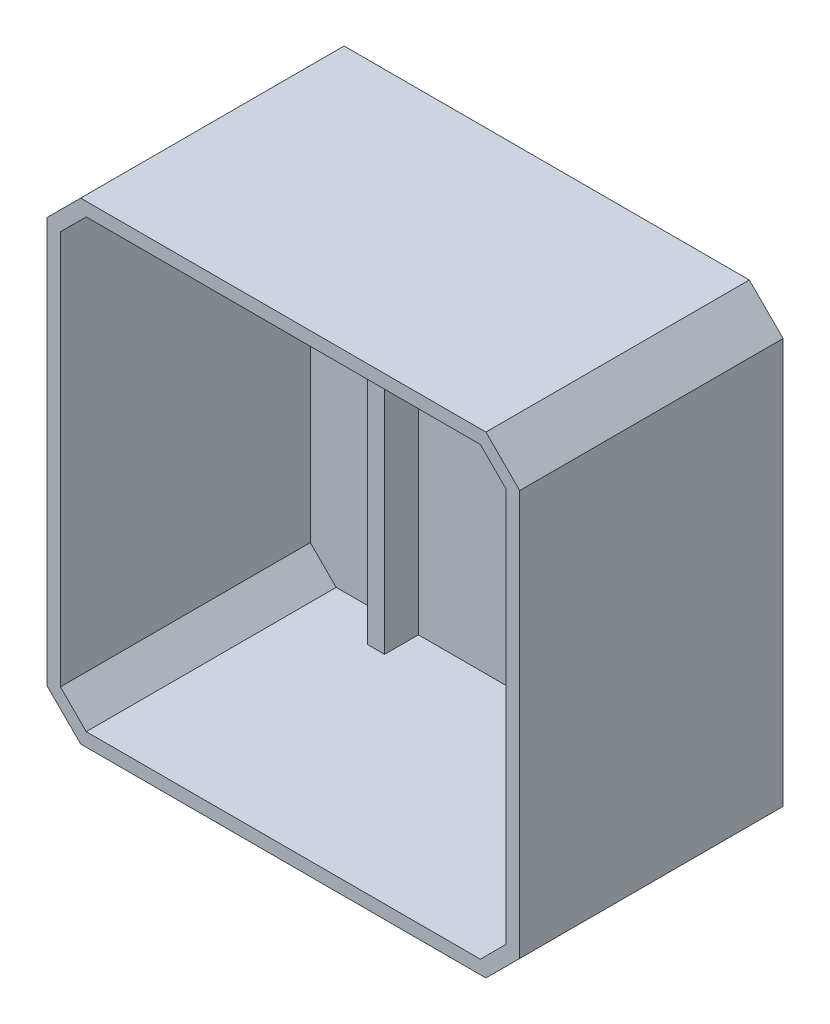
ISO-10303-21;
HEADER;
FILE_DESCRIPTION(('STEP AP214'),'2;1');
FILE_NAME('part.step','',(''),(''),'','','');
FILE_SCHEMA(('AUTOMOTIVE_DESIGN { 1 0 10303 214 1 1 1 1 }'));
ENDSEC;
DATA;
#1=APPLICATION_CONTEXT('core data for automotive mechanical design processes');
#2=APPLICATION_PROTOCOL_DEFINITION('international standard','automotive_design',2000,#1);
#3=PRODUCT_CONTEXT('',#1,'mechanical');
#4=PRODUCT('Part','Part','',(#3));
#5=PRODUCT_RELATED_PRODUCT_CATEGORY('part','',(#4));
#6=PRODUCT_DEFINITION_FORMATION('','',#4);
#7=PRODUCT_DEFINITION_CONTEXT('part definition',#1,'design');
#8=PRODUCT_DEFINITION('design','',#6,#7);
#9=PRODUCT_DEFINITION_SHAPE('','',#8);
#10=(LENGTH_UNIT() NAMED_UNIT(*) SI_UNIT(.MILLI.,.METRE.));
#11=(NAMED_UNIT(*) PLANE_ANGLE_UNIT() SI_UNIT($,.RADIAN.));
#12=(NAMED_UNIT(*) SI_UNIT($,.STERADIAN.) SOLID_ANGLE_UNIT());
#13=UNCERTAINTY_MEASURE_WITH_UNIT(LENGTH_MEASURE(1.E-05),#10,'distance_accuracy_value','');
#14=(GEOMETRIC_REPRESENTATION_CONTEXT(3) GLOBAL_UNCERTAINTY_ASSIGNED_CONTEXT((#13)) GLOBAL_UNIT_ASSIGNED_CONTEXT((#10,
#11,#12)) REPRESENTATION_CONTEXT('',''));
#15=CARTESIAN_POINT('',(0.,0.,0.));
#16=DIRECTION('',(0.,0.,1.));
#17=DIRECTION('',(1.,0.,0.));
#18=AXIS2_PLACEMENT_3D('',#15,#16,#17);
#19=CARTESIAN_POINT('',(51.822194683105,32.9266247379456,-39.));
#20=DIRECTION('',(0.,1.,0.));
#21=DIRECTION('',(0.,0.,1.));
#22=AXIS2_PLACEMENT_3D('',#19,#20,#21);
#23=PLANE('',#22);
#24=DIRECTION('',(0.,0.,-1.));
#25=VECTOR('',#24,1.);
#26=CARTESIAN_POINT('',(106.322194683105,32.9266247379456,-32.));
#27=LINE('',#26,#25);
#28=CARTESIAN_POINT('',(106.322194683105,32.9266247379456,-32.));
#29=VERTEX_POINT('',#28);
#30=CARTESIAN_POINT('',(106.322194683105,32.9266247379456,-37.));
#31=VERTEX_POINT('',#30);
#32=EDGE_CURVE('E219',#29,#31,#27,.T.);
#33=ORIENTED_EDGE('',*,*,#32,.T.);
#34=DIRECTION('',(-1.,0.,0.));
#35=VECTOR('',#34,1.);
#36=CARTESIAN_POINT('',(0.,32.9266247379456,-37.));
#37=LINE('',#36,#35);
#38=CARTESIAN_POINT('',(115.993767558359,32.9266247379456,-37.));
#39=VERTEX_POINT('',#38);
#40=EDGE_CURVE('E318',#39,#31,#37,.T.);
#41=ORIENTED_EDGE('',*,*,#40,.F.);
#42=DIRECTION('',(0.,0.,1.));
#43=VECTOR('',#42,1.);
#44=CARTESIAN_POINT('',(115.993767558359,32.9266247379456,-39.));
#45=LINE('',#44,#43);
#46=CARTESIAN_POINT('',(115.993767558359,32.9266247379456,0.));
#47=VERTEX_POINT('',#46);
#48=EDGE_CURVE('E292',#47,#39,#45,.F.);
#49=ORIENTED_EDGE('',*,*,#48,.F.);
#50=DIRECTION('',(-1.,0.,0.));
#51=VECTOR('',#50,1.);
#52=CARTESIAN_POINT('',(0.,32.9266247379456,0.));
#53=LINE('',#52,#51);
#54=CARTESIAN_POINT('',(57.6506218078512,32.9266247379456,0.));
#55=VERTEX_POINT('',#54);
#56=EDGE_CURVE('E287',#47,#55,#53,.T.);
#57=ORIENTED_EDGE('',*,*,#56,.T.);
#58=DIRECTION('',(0.,0.,-1.));
#59=VECTOR('',#58,1.);
#60=CARTESIAN_POINT('',(57.6506218078512,32.9266247379456,-39.));
#61=LINE('',#60,#59);
#62=CARTESIAN_POINT('',(57.6506218078512,32.9266247379456,-37.));
#63=VERTEX_POINT('',#62);
#64=EDGE_CURVE('E326',#63,#55,#61,.F.);
#65=ORIENTED_EDGE('',*,*,#64,.F.);
#66=CARTESIAN_POINT('',(67.322194683105,32.9266247379456,-37.));
#67=VERTEX_POINT('',#66);
#68=EDGE_CURVE('E301',#67,#63,#37,.T.);
#69=ORIENTED_EDGE('',*,*,#68,.F.);
#70=DIRECTION('',(0.,0.,-1.));
#71=VECTOR('',#70,1.);
#72=CARTESIAN_POINT('',(67.322194683105,32.9266247379456,-32.));
#73=LINE('',#72,#71);
#74=CARTESIAN_POINT('',(67.322194683105,32.9266247379456,-32.));
#75=VERTEX_POINT('',#74);
#76=EDGE_CURVE('E264',#75,#67,#73,.T.);
#77=ORIENTED_EDGE('',*,*,#76,.F.);
#78=DIRECTION('',(-1.,0.,0.));
#79=VECTOR('',#78,1.);
#80=CARTESIAN_POINT('',(67.322194683105,32.9266247379456,-32.));
#81=LINE('',#80,#79);
#82=CARTESIAN_POINT('',(69.822194683105,32.9266247379456,-32.));
#83=VERTEX_POINT('',#82);
#84=EDGE_CURVE('E261',#83,#75,#81,.T.);
#85=ORIENTED_EDGE('',*,*,#84,.F.);
#86=DIRECTION('',(0.,0.,-1.));
#87=VECTOR('',#86,1.);
#88=CARTESIAN_POINT('',(69.822194683105,32.9266247379456,-32.));
#89=LINE('',#88,#87);
#90=CARTESIAN_POINT('',(69.822194683105,32.9266247379456,-37.));
#91=VERTEX_POINT('',#90);
#92=EDGE_CURVE('E271',#83,#91,#89,.T.);
#93=ORIENTED_EDGE('',*,*,#92,.T.);
#94=CARTESIAN_POINT('',(103.822194683105,32.9266247379456,-37.));
#95=VERTEX_POINT('',#94);
#96=EDGE_CURVE('E322',#95,#91,#37,.T.);
#97=ORIENTED_EDGE('',*,*,#96,.F.);
#98=DIRECTION('',(0.,0.,-1.));
#99=VECTOR('',#98,1.);
#100=CARTESIAN_POINT('',(103.822194683105,32.9266247379456,-32.));
#101=LINE('',#100,#99);
#102=CARTESIAN_POINT('',(103.822194683105,32.9266247379456,-32.));
#103=VERTEX_POINT('',#102);
#104=EDGE_CURVE('E58',#103,#95,#101,.T.);
#105=ORIENTED_EDGE('',*,*,#104,.F.);
#106=DIRECTION('',(-1.,0.,0.));
#107=VECTOR('',#106,1.);
#108=CARTESIAN_POINT('',(106.322194683105,32.9266247379456,-32.));
#109=LINE('',#108,#107);
#110=EDGE_CURVE('E210',#29,#103,#109,.T.);
#111=ORIENTED_EDGE('',*,*,#110,.F.);
#112=EDGE_LOOP('',(#33,#41,#49,#57,#65,#69,#77,#85,#93,#97,#105,#111));
#113=FACE_BOUND('',#112,.T.);
#114=ADVANCED_FACE('F41',(#113),#23,.F.);
#115=CARTESIAN_POINT('',(51.822194683105,-33.0733752620544,-39.));
#116=DIRECTION('',(0.,-1.,0.));
#117=DIRECTION('',(0.,0.,-1.));
#118=AXIS2_PLACEMENT_3D('',#115,#116,#117);
#119=PLANE('',#118);
#120=DIRECTION('',(0.,0.,-1.));
#121=VECTOR('',#120,1.);
#122=CARTESIAN_POINT('',(106.322194683105,-33.0733752620544,-32.));
#123=LINE('',#122,#121);
#124=CARTESIAN_POINT('',(106.322194683105,-33.0733752620544,-32.));
#125=VERTEX_POINT('',#124);
#126=CARTESIAN_POINT('',(106.322194683105,-33.0733752620544,-37.));
#127=VERTEX_POINT('',#126);
#128=EDGE_CURVE('E238',#125,#127,#123,.T.);
#129=ORIENTED_EDGE('',*,*,#128,.F.);
#130=DIRECTION('',(1.,0.,0.));
#131=VECTOR('',#130,1.);
#132=CARTESIAN_POINT('',(106.322194683105,-33.0733752620544,-32.));
#133=LINE('',#132,#131);
#134=CARTESIAN_POINT('',(103.822194683105,-33.0733752620544,-32.));
#135=VERTEX_POINT('',#134);
#136=EDGE_CURVE('E212',#135,#125,#133,.T.);
#137=ORIENTED_EDGE('',*,*,#136,.F.);
#138=DIRECTION('',(0.,0.,-1.));
#139=VECTOR('',#138,1.);
#140=CARTESIAN_POINT('',(103.822194683105,-33.0733752620544,-32.));
#141=LINE('',#140,#139);
#142=CARTESIAN_POINT('',(103.822194683105,-33.0733752620544,-37.));
#143=VERTEX_POINT('',#142);
#144=EDGE_CURVE('E245',#135,#143,#141,.T.);
#145=ORIENTED_EDGE('',*,*,#144,.T.);
#146=DIRECTION('',(1.,0.,0.));
#147=VECTOR('',#146,1.);
#148=CARTESIAN_POINT('',(0.,-33.0733752620544,-37.));
#149=LINE('',#148,#147);
#150=CARTESIAN_POINT('',(69.822194683105,-33.0733752620544,-37.));
#151=VERTEX_POINT('',#150);
#152=EDGE_CURVE('E310',#151,#143,#149,.T.);
#153=ORIENTED_EDGE('',*,*,#152,.F.);
#154=DIRECTION('',(0.,0.,-1.));
#155=VECTOR('',#154,1.);
#156=CARTESIAN_POINT('',(69.822194683105,-33.0733752620544,-32.));
#157=LINE('',#156,#155);
#158=CARTESIAN_POINT('',(69.822194683105,-33.0733752620544,-32.));
#159=VERTEX_POINT('',#158);
#160=EDGE_CURVE('E66',#159,#151,#157,.T.);
#161=ORIENTED_EDGE('',*,*,#160,.F.);
#162=DIRECTION('',(1.,0.,0.));
#163=VECTOR('',#162,1.);
#164=CARTESIAN_POINT('',(67.322194683105,-33.0733752620544,-32.));
#165=LINE('',#164,#163);
#166=CARTESIAN_POINT('',(67.322194683105,-33.0733752620544,-32.));
#167=VERTEX_POINT('',#166);
#168=EDGE_CURVE('E254',#167,#159,#165,.T.);
#169=ORIENTED_EDGE('',*,*,#168,.F.);
#170=DIRECTION('',(0.,0.,-1.));
#171=VECTOR('',#170,1.);
#172=CARTESIAN_POINT('',(67.322194683105,-33.0733752620544,-32.));
#173=LINE('',#172,#171);
#174=CARTESIAN_POINT('',(67.322194683105,-33.0733752620544,-37.));
#175=VERTEX_POINT('',#174);
#176=EDGE_CURVE('E277',#167,#175,#173,.T.);
#177=ORIENTED_EDGE('',*,*,#176,.T.);
#178=CARTESIAN_POINT('',(57.6506218078512,-33.0733752620544,-37.));
#179=VERTEX_POINT('',#178);
#180=EDGE_CURVE('E302',#179,#175,#149,.T.);
#181=ORIENTED_EDGE('',*,*,#180,.F.);
#182=DIRECTION('',(0.,0.,1.));
#183=VECTOR('',#182,1.);
#184=CARTESIAN_POINT('',(57.6506218078512,-33.0733752620544,-39.));
#185=LINE('',#184,#183);
#186=CARTESIAN_POINT('',(57.6506218078512,-33.0733752620544,0.));
#187=VERTEX_POINT('',#186);
#188=EDGE_CURVE('E321',#187,#179,#185,.F.);
#189=ORIENTED_EDGE('',*,*,#188,.F.);
#190=DIRECTION('',(1.,0.,0.));
#191=VECTOR('',#190,1.);
#192=CARTESIAN_POINT('',(0.,-33.0733752620544,0.));
#193=LINE('',#192,#191);
#194=CARTESIAN_POINT('',(115.993767558359,-33.0733752620544,0.));
#195=VERTEX_POINT('',#194);
#196=EDGE_CURVE('E346',#187,#195,#193,.T.);
#197=ORIENTED_EDGE('',*,*,#196,.T.);
#198=DIRECTION('',(0.,0.,-1.));
#199=VECTOR('',#198,1.);
#200=CARTESIAN_POINT('',(115.993767558359,-33.0733752620544,-39.));
#201=LINE('',#200,#199);
#202=CARTESIAN_POINT('',(115.993767558359,-33.0733752620544,-37.));
#203=VERTEX_POINT('',#202);
#204=EDGE_CURVE('E338',#203,#195,#201,.F.);
#205=ORIENTED_EDGE('',*,*,#204,.F.);
#206=EDGE_CURVE('E286',#127,#203,#149,.T.);
#207=ORIENTED_EDGE('',*,*,#206,.F.);
#208=EDGE_LOOP('',(#129,#137,#145,#153,#161,#169,#177,#181,#189,#197,#205,#207));
#209=FACE_BOUND('',#208,.T.);
#210=ADVANCED_FACE('F491',(#209),#119,.F.);
#211=CARTESIAN_POINT('',(0.,0.,-37.));
#212=DIRECTION('',(0.,0.,1.));
#213=DIRECTION('',(1.,0.,0.));
#214=AXIS2_PLACEMENT_3D('',#211,#212,#213);
#215=PLANE('',#214);
#216=ORIENTED_EDGE('',*,*,#40,.T.);
#217=DIRECTION('',(0.,1.,0.));
#218=VECTOR('',#217,1.);
#219=CARTESIAN_POINT('',(106.322194683105,32.9266247379456,-37.));
#220=LINE('',#219,#218);
#221=EDGE_CURVE('E222',#127,#31,#220,.T.);
#222=ORIENTED_EDGE('',*,*,#221,.F.);
#223=ORIENTED_EDGE('',*,*,#206,.T.);
#224=DIRECTION('',(0.707106781186548,0.707106781186548,0.));
#225=VECTOR('',#224,1.);
#226=CARTESIAN_POINT('',(115.407981120732,-33.6591616996813,-37.));
#227=LINE('',#226,#225);
#228=CARTESIAN_POINT('',(119.822194683105,-29.2449481373081,-37.));
#229=VERTEX_POINT('',#228);
#230=EDGE_CURVE('E296',#229,#203,#227,.F.);
#231=ORIENTED_EDGE('',*,*,#230,.F.);
#232=DIRECTION('',(0.,1.,0.));
#233=VECTOR('',#232,1.);
#234=CARTESIAN_POINT('',(119.822194683105,0.,-37.));
#235=LINE('',#234,#233);
#236=CARTESIAN_POINT('',(119.822194683105,29.0981976131994,-37.));
#237=VERTEX_POINT('',#236);
#238=EDGE_CURVE('E297',#229,#237,#235,.T.);
#239=ORIENTED_EDGE('',*,*,#238,.T.);
#240=DIRECTION('',(-0.707106781186549,0.707106781186546,0.));
#241=VECTOR('',#240,1.);
#242=CARTESIAN_POINT('',(120.407981120732,28.5124111755725,-37.));
#243=LINE('',#242,#241);
#244=EDGE_CURVE('E317',#39,#237,#243,.F.);
#245=ORIENTED_EDGE('',*,*,#244,.F.);
#246=EDGE_LOOP('',(#216,#222,#223,#231,#239,#245));
#247=FACE_BOUND('',#246,.T.);
#248=ADVANCED_FACE('F497',(#247),#215,.T.);
#249=ORIENTED_EDGE('',*,*,#152,.T.);
#250=DIRECTION('',(0.,-1.,0.));
#251=VECTOR('',#250,1.);
#252=CARTESIAN_POINT('',(103.822194683105,32.9266247379456,-37.));
#253=LINE('',#252,#251);
#254=EDGE_CURVE('E216',#95,#143,#253,.T.);
#255=ORIENTED_EDGE('',*,*,#254,.F.);
#256=ORIENTED_EDGE('',*,*,#96,.T.);
#257=DIRECTION('',(0.,1.,0.));
#258=VECTOR('',#257,1.);
#259=CARTESIAN_POINT('',(69.822194683105,32.9266247379456,-37.));
#260=LINE('',#259,#258);
#261=EDGE_CURVE('E255',#151,#91,#260,.T.);
#262=ORIENTED_EDGE('',*,*,#261,.F.);
#263=EDGE_LOOP('',(#249,#255,#256,#262));
#264=FACE_BOUND('',#263,.T.);
#265=ADVANCED_FACE('F511',(#264),#215,.T.);
#266=ORIENTED_EDGE('',*,*,#180,.T.);
#267=DIRECTION('',(0.,-1.,0.));
#268=VECTOR('',#267,1.);
#269=CARTESIAN_POINT('',(67.322194683105,32.9266247379456,-37.));
#270=LINE('',#269,#268);
#271=EDGE_CURVE('E227',#67,#175,#270,.T.);
#272=ORIENTED_EDGE('',*,*,#271,.F.);
#273=ORIENTED_EDGE('',*,*,#68,.T.);
#274=DIRECTION('',(-0.707106781186546,-0.707106781186549,0.));
#275=VECTOR('',#274,1.);
#276=CARTESIAN_POINT('',(58.2364082454781,33.5124111755725,-37.));
#277=LINE('',#276,#275);
#278=CARTESIAN_POINT('',(53.822194683105,29.0981976131994,-37.));
#279=VERTEX_POINT('',#278);
#280=EDGE_CURVE('E313',#279,#63,#277,.F.);
#281=ORIENTED_EDGE('',*,*,#280,.F.);
#282=DIRECTION('',(0.,-1.,0.));
#283=VECTOR('',#282,1.);
#284=CARTESIAN_POINT('',(53.822194683105,0.,-37.));
#285=LINE('',#284,#283);
#286=CARTESIAN_POINT('',(53.822194683105,-29.2449481373082,-37.));
#287=VERTEX_POINT('',#286);
#288=EDGE_CURVE('E282',#279,#287,#285,.T.);
#289=ORIENTED_EDGE('',*,*,#288,.T.);
#290=DIRECTION('',(0.70710678118655,-0.707106781186546,0.));
#291=VECTOR('',#290,1.);
#292=CARTESIAN_POINT('',(53.2364082454781,-28.6591616996813,-37.));
#293=LINE('',#292,#291);
#294=EDGE_CURVE('E306',#179,#287,#293,.F.);
#295=ORIENTED_EDGE('',*,*,#294,.F.);
#296=EDGE_LOOP('',(#266,#272,#273,#281,#289,#295));
#297=FACE_BOUND('',#296,.T.);
#298=ADVANCED_FACE('F508',(#297),#215,.T.);
#299=CARTESIAN_POINT('',(51.822194683105,34.9266247379456,-39.));
#300=DIRECTION('',(-1.,0.,0.));
#301=DIRECTION('',(0.,0.,1.));
#302=AXIS2_PLACEMENT_3D('',#299,#300,#301);
#303=PLANE('',#302);
#304=DIRECTION('',(0.,-1.,0.));
#305=VECTOR('',#304,1.);
#306=CARTESIAN_POINT('',(51.822194683105,34.9266247379456,-39.));
#307=LINE('',#306,#305);
#308=CARTESIAN_POINT('',(51.822194683105,29.9266247379456,-39.));
#309=VERTEX_POINT('',#308);
#310=CARTESIAN_POINT('',(51.822194683105,-30.0733752620544,-39.));
#311=VERTEX_POINT('',#310);
#312=EDGE_CURVE('E367',#309,#311,#307,.T.);
#313=ORIENTED_EDGE('',*,*,#312,.T.);
#314=DIRECTION('',(0.,0.,1.));
#315=VECTOR('',#314,1.);
#316=CARTESIAN_POINT('',(51.822194683105,-30.0733752620544,-39.));
#317=LINE('',#316,#315);
#318=CARTESIAN_POINT('',(51.822194683105,-30.0733752620544,0.));
#319=VERTEX_POINT('',#318);
#320=EDGE_CURVE('E439',#311,#319,#317,.T.);
#321=ORIENTED_EDGE('',*,*,#320,.T.);
#322=DIRECTION('',(0.,-1.,0.));
#323=VECTOR('',#322,1.);
#324=CARTESIAN_POINT('',(51.822194683105,34.9266247379456,0.));
#325=LINE('',#324,#323);
#326=CARTESIAN_POINT('',(51.822194683105,29.9266247379456,0.));
#327=VERTEX_POINT('',#326);
#328=EDGE_CURVE('E329',#327,#319,#325,.T.);
#329=ORIENTED_EDGE('',*,*,#328,.F.);
#330=DIRECTION('',(0.,0.,-1.));
#331=VECTOR('',#330,1.);
#332=CARTESIAN_POINT('',(51.822194683105,29.9266247379456,-39.));
#333=LINE('',#332,#331);
#334=EDGE_CURVE('E436',#327,#309,#333,.T.);
#335=ORIENTED_EDGE('',*,*,#334,.T.);
#336=EDGE_LOOP('',(#313,#321,#329,#335));
#337=FACE_BOUND('',#336,.T.);
#338=ADVANCED_FACE('F478',(#337),#303,.T.);
#339=CARTESIAN_POINT('',(51.822194683105,34.9266247379456,-39.));
#340=DIRECTION('',(0.,1.,0.));
#341=DIRECTION('',(0.,0.,1.));
#342=AXIS2_PLACEMENT_3D('',#339,#340,#341);
#343=PLANE('',#342);
#344=DIRECTION('',(-1.,0.,0.));
#345=VECTOR('',#344,1.);
#346=CARTESIAN_POINT('',(51.822194683105,34.9266247379456,-39.));
#347=LINE('',#346,#345);
#348=CARTESIAN_POINT('',(116.822194683105,34.9266247379456,-39.));
#349=VERTEX_POINT('',#348);
#350=CARTESIAN_POINT('',(56.822194683105,34.9266247379456,-39.));
#351=VERTEX_POINT('',#350);
#352=EDGE_CURVE('E380',#349,#351,#347,.T.);
#353=ORIENTED_EDGE('',*,*,#352,.T.);
#354=DIRECTION('',(0.,0.,1.));
#355=VECTOR('',#354,1.);
#356=CARTESIAN_POINT('',(56.822194683105,34.9266247379456,-39.));
#357=LINE('',#356,#355);
#358=CARTESIAN_POINT('',(56.822194683105,34.9266247379456,0.));
#359=VERTEX_POINT('',#358);
#360=EDGE_CURVE('E11',#351,#359,#357,.T.);
#361=ORIENTED_EDGE('',*,*,#360,.T.);
#362=DIRECTION('',(-1.,0.,0.));
#363=VECTOR('',#362,1.);
#364=CARTESIAN_POINT('',(51.822194683105,34.9266247379456,0.));
#365=LINE('',#364,#363);
#366=CARTESIAN_POINT('',(116.822194683105,34.9266247379456,0.));
#367=VERTEX_POINT('',#366);
#368=EDGE_CURVE('E372',#367,#359,#365,.T.);
#369=ORIENTED_EDGE('',*,*,#368,.F.);
#370=DIRECTION('',(0.,0.,-1.));
#371=VECTOR('',#370,1.);
#372=CARTESIAN_POINT('',(116.822194683105,34.9266247379456,-39.));
#373=LINE('',#372,#371);
#374=EDGE_CURVE('E51',#367,#349,#373,.T.);
#375=ORIENTED_EDGE('',*,*,#374,.T.);
#376=EDGE_LOOP('',(#353,#361,#369,#375));
#377=FACE_BOUND('',#376,.T.);
#378=ADVANCED_FACE('F447',(#377),#343,.T.);
#379=CARTESIAN_POINT('',(121.822194683105,34.9266247379456,-39.));
#380=DIRECTION('',(1.,0.,0.));
#381=DIRECTION('',(0.,1.,0.));
#382=AXIS2_PLACEMENT_3D('',#379,#380,#381);
#383=PLANE('',#382);
#384=DIRECTION('',(0.,1.,0.));
#385=VECTOR('',#384,1.);
#386=CARTESIAN_POINT('',(121.822194683105,34.9266247379456,0.));
#387=LINE('',#386,#385);
#388=CARTESIAN_POINT('',(121.822194683105,-30.0733752620543,0.));
#389=VERTEX_POINT('',#388);
#390=CARTESIAN_POINT('',(121.822194683105,29.9266247379456,0.));
#391=VERTEX_POINT('',#390);
#392=EDGE_CURVE('E392',#389,#391,#387,.T.);
#393=ORIENTED_EDGE('',*,*,#392,.F.);
#394=DIRECTION('',(0.,0.,-1.));
#395=VECTOR('',#394,1.);
#396=CARTESIAN_POINT('',(121.822194683105,-30.0733752620543,-39.));
#397=LINE('',#396,#395);
#398=CARTESIAN_POINT('',(121.822194683105,-30.0733752620543,-39.));
#399=VERTEX_POINT('',#398);
#400=EDGE_CURVE('E421',#389,#399,#397,.T.);
#401=ORIENTED_EDGE('',*,*,#400,.T.);
#402=DIRECTION('',(0.,1.,0.));
#403=VECTOR('',#402,1.);
#404=CARTESIAN_POINT('',(121.822194683105,34.9266247379456,-39.));
#405=LINE('',#404,#403);
#406=CARTESIAN_POINT('',(121.822194683105,29.9266247379456,-39.));
#407=VERTEX_POINT('',#406);
#408=EDGE_CURVE('E376',#399,#407,#405,.T.);
#409=ORIENTED_EDGE('',*,*,#408,.T.);
#410=DIRECTION('',(0.,0.,1.));
#411=VECTOR('',#410,1.);
#412=CARTESIAN_POINT('',(121.822194683105,29.9266247379456,-39.));
#413=LINE('',#412,#411);
#414=EDGE_CURVE('E417',#407,#391,#413,.T.);
#415=ORIENTED_EDGE('',*,*,#414,.T.);
#416=EDGE_LOOP('',(#393,#401,#409,#415));
#417=FACE_BOUND('',#416,.T.);
#418=ADVANCED_FACE('F459',(#417),#383,.T.);
#419=CARTESIAN_POINT('',(51.822194683105,-35.0733752620544,-39.));
#420=DIRECTION('',(0.,-1.,0.));
#421=DIRECTION('',(0.,0.,-1.));
#422=AXIS2_PLACEMENT_3D('',#419,#420,#421);
#423=PLANE('',#422);
#424=DIRECTION('',(1.,0.,0.));
#425=VECTOR('',#424,1.);
#426=CARTESIAN_POINT('',(51.822194683105,-35.0733752620544,-39.));
#427=LINE('',#426,#425);
#428=CARTESIAN_POINT('',(56.822194683105,-35.0733752620544,-39.));
#429=VERTEX_POINT('',#428);
#430=CARTESIAN_POINT('',(116.822194683105,-35.0733752620544,-39.));
#431=VERTEX_POINT('',#430);
#432=EDGE_CURVE('E371',#429,#431,#427,.T.);
#433=ORIENTED_EDGE('',*,*,#432,.T.);
#434=DIRECTION('',(0.,0.,1.));
#435=VECTOR('',#434,1.);
#436=CARTESIAN_POINT('',(116.822194683105,-35.0733752620544,-39.));
#437=LINE('',#436,#435);
#438=CARTESIAN_POINT('',(116.822194683105,-35.0733752620544,0.));
#439=VERTEX_POINT('',#438);
#440=EDGE_CURVE('E401',#431,#439,#437,.T.);
#441=ORIENTED_EDGE('',*,*,#440,.T.);
#442=DIRECTION('',(1.,0.,0.));
#443=VECTOR('',#442,1.);
#444=CARTESIAN_POINT('',(51.822194683105,-35.0733752620544,0.));
#445=LINE('',#444,#443);
#446=CARTESIAN_POINT('',(56.822194683105,-35.0733752620544,0.));
#447=VERTEX_POINT('',#446);
#448=EDGE_CURVE('E388',#447,#439,#445,.T.);
#449=ORIENTED_EDGE('',*,*,#448,.F.);
#450=DIRECTION('',(0.,0.,-1.));
#451=VECTOR('',#450,1.);
#452=CARTESIAN_POINT('',(56.822194683105,-35.0733752620544,-39.));
#453=LINE('',#452,#451);
#454=EDGE_CURVE('E384',#447,#429,#453,.T.);
#455=ORIENTED_EDGE('',*,*,#454,.T.);
#456=EDGE_LOOP('',(#433,#441,#449,#455));
#457=FACE_BOUND('',#456,.T.);
#458=ADVANCED_FACE('F469',(#457),#423,.T.);
#459=CARTESIAN_POINT('',(0.,0.,-39.));
#460=DIRECTION('',(0.,0.,1.));
#461=DIRECTION('',(1.,0.,0.));
#462=AXIS2_PLACEMENT_3D('',#459,#460,#461);
#463=PLANE('',#462);
#464=ORIENTED_EDGE('',*,*,#408,.F.);
#465=DIRECTION('',(0.707106781186548,0.707106781186548,0.));
#466=VECTOR('',#465,1.);
#467=CARTESIAN_POINT('',(116.822194683105,-35.0733752620544,-39.));
#468=LINE('',#467,#466);
#469=EDGE_CURVE('E433',#399,#431,#468,.F.);
#470=ORIENTED_EDGE('',*,*,#469,.T.);
#471=ORIENTED_EDGE('',*,*,#432,.F.);
#472=DIRECTION('',(0.70710678118655,-0.707106781186546,0.));
#473=VECTOR('',#472,1.);
#474=CARTESIAN_POINT('',(51.822194683105,-30.0733752620544,-39.));
#475=LINE('',#474,#473);
#476=EDGE_CURVE('E430',#429,#311,#475,.F.);
#477=ORIENTED_EDGE('',*,*,#476,.T.);
#478=ORIENTED_EDGE('',*,*,#312,.F.);
#479=DIRECTION('',(-0.707106781186546,-0.707106781186549,0.));
#480=VECTOR('',#479,1.);
#481=CARTESIAN_POINT('',(56.822194683105,34.9266247379456,-39.));
#482=LINE('',#481,#480);
#483=EDGE_CURVE('E427',#309,#351,#482,.F.);
#484=ORIENTED_EDGE('',*,*,#483,.T.);
#485=ORIENTED_EDGE('',*,*,#352,.F.);
#486=DIRECTION('',(-0.707106781186549,0.707106781186546,0.));
#487=VECTOR('',#486,1.);
#488=CARTESIAN_POINT('',(121.822194683105,29.9266247379456,-39.));
#489=LINE('',#488,#487);
#490=EDGE_CURVE('E424',#349,#407,#489,.F.);
#491=ORIENTED_EDGE('',*,*,#490,.T.);
#492=EDGE_LOOP('',(#464,#470,#471,#477,#478,#484,#485,#491));
#493=FACE_BOUND('',#492,.T.);
#494=ADVANCED_FACE('F453',(#493),#463,.F.);
#495=CARTESIAN_POINT('',(0.,0.,0.));
#496=DIRECTION('',(0.,0.,1.));
#497=DIRECTION('',(1.,0.,0.));
#498=AXIS2_PLACEMENT_3D('',#495,#496,#497);
#499=PLANE('',#498);
#500=ORIENTED_EDGE('',*,*,#196,.F.);
#501=DIRECTION('',(-0.70710678118655,0.707106781186546,0.));
#502=VECTOR('',#501,1.);
#503=CARTESIAN_POINT('',(12.2886232728983,12.2886232728983,0.));
#504=LINE('',#503,#502);
#505=CARTESIAN_POINT('',(53.822194683105,-29.2449481373082,0.));
#506=VERTEX_POINT('',#505);
#507=EDGE_CURVE('E347',#506,#187,#504,.F.);
#508=ORIENTED_EDGE('',*,*,#507,.F.);
#509=DIRECTION('',(0.,-1.,0.));
#510=VECTOR('',#509,1.);
#511=CARTESIAN_POINT('',(53.822194683105,0.,0.));
#512=LINE('',#511,#510);
#513=CARTESIAN_POINT('',(53.822194683105,29.0981976131994,0.));
#514=VERTEX_POINT('',#513);
#515=EDGE_CURVE('E281',#514,#506,#512,.T.);
#516=ORIENTED_EDGE('',*,*,#515,.F.);
#517=DIRECTION('',(0.707106781186546,0.707106781186549,0.));
#518=VECTOR('',#517,1.);
#519=CARTESIAN_POINT('',(12.3619985349529,-12.3619985349529,0.));
#520=LINE('',#519,#518);
#521=EDGE_CURVE('E350',#55,#514,#520,.F.);
#522=ORIENTED_EDGE('',*,*,#521,.F.);
#523=ORIENTED_EDGE('',*,*,#56,.F.);
#524=DIRECTION('',(0.707106781186549,-0.707106781186546,0.));
#525=VECTOR('',#524,1.);
#526=CARTESIAN_POINT('',(74.4601961481519,74.4601961481523,0.));
#527=LINE('',#526,#525);
#528=CARTESIAN_POINT('',(119.822194683105,29.0981976131994,0.));
#529=VERTEX_POINT('',#528);
#530=EDGE_CURVE('E341',#529,#47,#527,.F.);
#531=ORIENTED_EDGE('',*,*,#530,.F.);
#532=DIRECTION('',(0.,1.,0.));
#533=VECTOR('',#532,1.);
#534=CARTESIAN_POINT('',(119.822194683105,0.,0.));
#535=LINE('',#534,#533);
#536=CARTESIAN_POINT('',(119.822194683105,-29.2449481373081,0.));
#537=VERTEX_POINT('',#536);
#538=EDGE_CURVE('E354',#537,#529,#535,.T.);
#539=ORIENTED_EDGE('',*,*,#538,.F.);
#540=DIRECTION('',(-0.707106781186548,-0.707106781186548,0.));
#541=VECTOR('',#540,1.);
#542=CARTESIAN_POINT('',(74.5335714102066,-74.5335714102066,0.));
#543=LINE('',#542,#541);
#544=EDGE_CURVE('E335',#195,#537,#543,.F.);
#545=ORIENTED_EDGE('',*,*,#544,.F.);
#546=EDGE_LOOP('',(#500,#508,#516,#522,#523,#531,#539,#545));
#547=FACE_BOUND('',#546,.T.);
#548=ORIENTED_EDGE('',*,*,#448,.T.);
#549=DIRECTION('',(-0.707106781186548,-0.707106781186548,0.));
#550=VECTOR('',#549,1.);
#551=CARTESIAN_POINT('',(75.9477849725797,-75.9477849725797,0.));
#552=LINE('',#551,#550);
#553=EDGE_CURVE('E414',#439,#389,#552,.F.);
#554=ORIENTED_EDGE('',*,*,#553,.T.);
#555=ORIENTED_EDGE('',*,*,#392,.T.);
#556=DIRECTION('',(0.707106781186549,-0.707106781186546,0.));
#557=VECTOR('',#556,1.);
#558=CARTESIAN_POINT('',(75.874409710525,75.8744097105254,0.));
#559=LINE('',#558,#557);
#560=EDGE_CURVE('E405',#391,#367,#559,.F.);
#561=ORIENTED_EDGE('',*,*,#560,.T.);
#562=ORIENTED_EDGE('',*,*,#368,.T.);
#563=DIRECTION('',(0.707106781186546,0.707106781186549,0.));
#564=VECTOR('',#563,1.);
#565=CARTESIAN_POINT('',(10.9477849725798,-10.9477849725798,0.));
#566=LINE('',#565,#564);
#567=EDGE_CURVE('E408',#359,#327,#566,.F.);
#568=ORIENTED_EDGE('',*,*,#567,.T.);
#569=ORIENTED_EDGE('',*,*,#328,.T.);
#570=DIRECTION('',(-0.70710678118655,0.707106781186546,0.));
#571=VECTOR('',#570,1.);
#572=CARTESIAN_POINT('',(10.8744097105252,10.8744097105252,0.));
#573=LINE('',#572,#571);
#574=EDGE_CURVE('E411',#319,#447,#573,.F.);
#575=ORIENTED_EDGE('',*,*,#574,.T.);
#576=EDGE_LOOP('',(#548,#554,#555,#561,#562,#568,#569,#575));
#577=FACE_BOUND('',#576,.T.);
#578=ADVANCED_FACE('F462',(#547,#577),#499,.T.);
#579=CARTESIAN_POINT('',(116.822194683105,-35.0733752620544,-39.));
#580=DIRECTION('',(-0.707106781186547,0.707106781186547,0.));
#581=DIRECTION('',(0.,0.,1.));
#582=AXIS2_PLACEMENT_3D('',#579,#580,#581);
#583=PLANE('',#582);
#584=ORIENTED_EDGE('',*,*,#469,.F.);
#585=ORIENTED_EDGE('',*,*,#400,.F.);
#586=ORIENTED_EDGE('',*,*,#553,.F.);
#587=ORIENTED_EDGE('',*,*,#440,.F.);
#588=EDGE_LOOP('',(#584,#585,#586,#587));
#589=FACE_BOUND('',#588,.T.);
#590=ADVANCED_FACE('F467',(#589),#583,.F.);
#591=CARTESIAN_POINT('',(51.822194683105,-30.0733752620544,-39.));
#592=DIRECTION('',(0.707106781186545,0.707106781186549,0.));
#593=DIRECTION('',(0.,0.,1.));
#594=AXIS2_PLACEMENT_3D('',#591,#592,#593);
#595=PLANE('',#594);
#596=ORIENTED_EDGE('',*,*,#476,.F.);
#597=ORIENTED_EDGE('',*,*,#454,.F.);
#598=ORIENTED_EDGE('',*,*,#574,.F.);
#599=ORIENTED_EDGE('',*,*,#320,.F.);
#600=EDGE_LOOP('',(#596,#597,#598,#599));
#601=FACE_BOUND('',#600,.T.);
#602=ADVANCED_FACE('F475',(#601),#595,.F.);
#603=CARTESIAN_POINT('',(56.822194683105,34.9266247379456,-39.));
#604=DIRECTION('',(0.707106781186549,-0.707106781186545,0.));
#605=DIRECTION('',(0.,0.,1.));
#606=AXIS2_PLACEMENT_3D('',#603,#604,#605);
#607=PLANE('',#606);
#608=ORIENTED_EDGE('',*,*,#483,.F.);
#609=ORIENTED_EDGE('',*,*,#334,.F.);
#610=ORIENTED_EDGE('',*,*,#567,.F.);
#611=ORIENTED_EDGE('',*,*,#360,.F.);
#612=EDGE_LOOP('',(#608,#609,#610,#611));
#613=FACE_BOUND('',#612,.T.);
#614=ADVANCED_FACE('F481',(#613),#607,.F.);
#615=CARTESIAN_POINT('',(121.822194683105,29.9266247379456,-39.));
#616=DIRECTION('',(-0.707106781186545,-0.707106781186549,0.));
#617=DIRECTION('',(0.,0.,1.));
#618=AXIS2_PLACEMENT_3D('',#615,#616,#617);
#619=PLANE('',#618);
#620=ORIENTED_EDGE('',*,*,#490,.F.);
#621=ORIENTED_EDGE('',*,*,#374,.F.);
#622=ORIENTED_EDGE('',*,*,#560,.F.);
#623=ORIENTED_EDGE('',*,*,#414,.F.);
#624=EDGE_LOOP('',(#620,#621,#622,#623));
#625=FACE_BOUND('',#624,.T.);
#626=ADVANCED_FACE('F44',(#625),#619,.F.);
#627=CARTESIAN_POINT('',(53.822194683105,34.9266247379456,-39.));
#628=DIRECTION('',(-1.,0.,0.));
#629=DIRECTION('',(0.,0.,1.));
#630=AXIS2_PLACEMENT_3D('',#627,#628,#629);
#631=PLANE('',#630);
#632=ORIENTED_EDGE('',*,*,#288,.F.);
#633=DIRECTION('',(0.,0.,1.));
#634=VECTOR('',#633,1.);
#635=CARTESIAN_POINT('',(53.822194683105,29.0981976131994,-39.));
#636=LINE('',#635,#634);
#637=EDGE_CURVE('E293',#514,#279,#636,.F.);
#638=ORIENTED_EDGE('',*,*,#637,.F.);
#639=ORIENTED_EDGE('',*,*,#515,.T.);
#640=DIRECTION('',(0.,0.,-1.));
#641=VECTOR('',#640,1.);
#642=CARTESIAN_POINT('',(53.822194683105,-29.2449481373082,-39.));
#643=LINE('',#642,#641);
#644=EDGE_CURVE('E288',#287,#506,#643,.F.);
#645=ORIENTED_EDGE('',*,*,#644,.F.);
#646=EDGE_LOOP('',(#632,#638,#639,#645));
#647=FACE_BOUND('',#646,.T.);
#648=ADVANCED_FACE('F487',(#647),#631,.F.);
#649=CARTESIAN_POINT('',(119.822194683105,34.9266247379456,-39.));
#650=DIRECTION('',(1.,0.,0.));
#651=DIRECTION('',(0.,1.,0.));
#652=AXIS2_PLACEMENT_3D('',#649,#650,#651);
#653=PLANE('',#652);
#654=ORIENTED_EDGE('',*,*,#538,.T.);
#655=DIRECTION('',(0.,0.,-1.));
#656=VECTOR('',#655,1.);
#657=CARTESIAN_POINT('',(119.822194683105,29.0981976131994,-39.));
#658=LINE('',#657,#656);
#659=EDGE_CURVE('E332',#237,#529,#658,.F.);
#660=ORIENTED_EDGE('',*,*,#659,.F.);
#661=ORIENTED_EDGE('',*,*,#238,.F.);
#662=DIRECTION('',(0.,0.,1.));
#663=VECTOR('',#662,1.);
#664=CARTESIAN_POINT('',(119.822194683105,-29.2449481373082,-39.));
#665=LINE('',#664,#663);
#666=EDGE_CURVE('E325',#537,#229,#665,.F.);
#667=ORIENTED_EDGE('',*,*,#666,.F.);
#668=EDGE_LOOP('',(#654,#660,#661,#667));
#669=FACE_BOUND('',#668,.T.);
#670=ADVANCED_FACE('F503',(#669),#653,.F.);
#671=CARTESIAN_POINT('',(115.407981120732,-33.6591616996813,-39.));
#672=DIRECTION('',(-0.707106781186547,0.707106781186547,0.));
#673=DIRECTION('',(0.,0.,1.));
#674=AXIS2_PLACEMENT_3D('',#671,#672,#673);
#675=PLANE('',#674);
#676=ORIENTED_EDGE('',*,*,#230,.T.);
#677=ORIENTED_EDGE('',*,*,#204,.T.);
#678=ORIENTED_EDGE('',*,*,#544,.T.);
#679=ORIENTED_EDGE('',*,*,#666,.T.);
#680=EDGE_LOOP('',(#676,#677,#678,#679));
#681=FACE_BOUND('',#680,.T.);
#682=ADVANCED_FACE('F505',(#681),#675,.T.);
#683=CARTESIAN_POINT('',(53.2364082454781,-28.6591616996813,-39.));
#684=DIRECTION('',(0.707106781186545,0.707106781186549,0.));
#685=DIRECTION('',(0.,0.,1.));
#686=AXIS2_PLACEMENT_3D('',#683,#684,#685);
#687=PLANE('',#686);
#688=ORIENTED_EDGE('',*,*,#294,.T.);
#689=ORIENTED_EDGE('',*,*,#644,.T.);
#690=ORIENTED_EDGE('',*,*,#507,.T.);
#691=ORIENTED_EDGE('',*,*,#188,.T.);
#692=EDGE_LOOP('',(#688,#689,#690,#691));
#693=FACE_BOUND('',#692,.T.);
#694=ADVANCED_FACE('F515',(#693),#687,.T.);
#695=CARTESIAN_POINT('',(58.2364082454781,33.5124111755725,-39.));
#696=DIRECTION('',(0.707106781186549,-0.707106781186545,0.));
#697=DIRECTION('',(0.,0.,1.));
#698=AXIS2_PLACEMENT_3D('',#695,#696,#697);
#699=PLANE('',#698);
#700=ORIENTED_EDGE('',*,*,#280,.T.);
#701=ORIENTED_EDGE('',*,*,#64,.T.);
#702=ORIENTED_EDGE('',*,*,#521,.T.);
#703=ORIENTED_EDGE('',*,*,#637,.T.);
#704=EDGE_LOOP('',(#700,#701,#702,#703));
#705=FACE_BOUND('',#704,.T.);
#706=ADVANCED_FACE('F519',(#705),#699,.T.);
#707=CARTESIAN_POINT('',(120.407981120732,28.5124111755725,-39.));
#708=DIRECTION('',(-0.707106781186545,-0.707106781186549,0.));
#709=DIRECTION('',(0.,0.,1.));
#710=AXIS2_PLACEMENT_3D('',#707,#708,#709);
#711=PLANE('',#710);
#712=ORIENTED_EDGE('',*,*,#244,.T.);
#713=ORIENTED_EDGE('',*,*,#659,.T.);
#714=ORIENTED_EDGE('',*,*,#530,.T.);
#715=ORIENTED_EDGE('',*,*,#48,.T.);
#716=EDGE_LOOP('',(#712,#713,#714,#715));
#717=FACE_BOUND('',#716,.T.);
#718=ADVANCED_FACE('F523',(#717),#711,.T.);
#719=CARTESIAN_POINT('',(67.322194683105,32.9266247379456,-32.));
#720=DIRECTION('',(1.,0.,0.));
#721=DIRECTION('',(0.,1.,0.));
#722=AXIS2_PLACEMENT_3D('',#719,#720,#721);
#723=PLANE('',#722);
#724=ORIENTED_EDGE('',*,*,#271,.T.);
#725=ORIENTED_EDGE('',*,*,#176,.F.);
#726=DIRECTION('',(0.,-1.,0.));
#727=VECTOR('',#726,1.);
#728=CARTESIAN_POINT('',(67.322194683105,32.9266247379456,-32.));
#729=LINE('',#728,#727);
#730=EDGE_CURVE('E251',#75,#167,#729,.T.);
#731=ORIENTED_EDGE('',*,*,#730,.F.);
#732=ORIENTED_EDGE('',*,*,#76,.T.);
#733=EDGE_LOOP('',(#724,#725,#731,#732));
#734=FACE_BOUND('',#733,.T.);
#735=ADVANCED_FACE('F527',(#734),#723,.F.);
#736=CARTESIAN_POINT('',(69.822194683105,32.9266247379456,-32.));
#737=DIRECTION('',(-1.,0.,0.));
#738=DIRECTION('',(0.,-1.,0.));
#739=AXIS2_PLACEMENT_3D('',#736,#737,#738);
#740=PLANE('',#739);
#741=ORIENTED_EDGE('',*,*,#261,.T.);
#742=ORIENTED_EDGE('',*,*,#92,.F.);
#743=DIRECTION('',(0.,1.,0.));
#744=VECTOR('',#743,1.);
#745=CARTESIAN_POINT('',(69.822194683105,32.9266247379456,-32.));
#746=LINE('',#745,#744);
#747=EDGE_CURVE('E258',#159,#83,#746,.T.);
#748=ORIENTED_EDGE('',*,*,#747,.F.);
#749=ORIENTED_EDGE('',*,*,#160,.T.);
#750=EDGE_LOOP('',(#741,#742,#748,#749));
#751=FACE_BOUND('',#750,.T.);
#752=ADVANCED_FACE('F654',(#751),#740,.F.);
#753=CARTESIAN_POINT('',(0.,0.,-32.));
#754=DIRECTION('',(0.,0.,1.));
#755=DIRECTION('',(1.,0.,0.));
#756=AXIS2_PLACEMENT_3D('',#753,#754,#755);
#757=PLANE('',#756);
#758=ORIENTED_EDGE('',*,*,#730,.T.);
#759=ORIENTED_EDGE('',*,*,#168,.T.);
#760=ORIENTED_EDGE('',*,*,#747,.T.);
#761=ORIENTED_EDGE('',*,*,#84,.T.);
#762=EDGE_LOOP('',(#758,#759,#760,#761));
#763=FACE_BOUND('',#762,.T.);
#764=ADVANCED_FACE('F660',(#763),#757,.T.);
#765=CARTESIAN_POINT('',(106.322194683105,32.9266247379456,-32.));
#766=DIRECTION('',(-1.,0.,0.));
#767=DIRECTION('',(0.,-1.,0.));
#768=AXIS2_PLACEMENT_3D('',#765,#766,#767);
#769=PLANE('',#768);
#770=ORIENTED_EDGE('',*,*,#221,.T.);
#771=ORIENTED_EDGE('',*,*,#32,.F.);
#772=DIRECTION('',(0.,1.,0.));
#773=VECTOR('',#772,1.);
#774=CARTESIAN_POINT('',(106.322194683105,32.9266247379456,-32.));
#775=LINE('',#774,#773);
#776=EDGE_CURVE('E206',#125,#29,#775,.T.);
#777=ORIENTED_EDGE('',*,*,#776,.F.);
#778=ORIENTED_EDGE('',*,*,#128,.T.);
#779=EDGE_LOOP('',(#770,#771,#777,#778));
#780=FACE_BOUND('',#779,.T.);
#781=ADVANCED_FACE('F220',(#780),#769,.F.);
#782=CARTESIAN_POINT('',(103.822194683105,32.9266247379456,-32.));
#783=DIRECTION('',(1.,0.,0.));
#784=DIRECTION('',(0.,1.,0.));
#785=AXIS2_PLACEMENT_3D('',#782,#783,#784);
#786=PLANE('',#785);
#787=ORIENTED_EDGE('',*,*,#254,.T.);
#788=ORIENTED_EDGE('',*,*,#144,.F.);
#789=DIRECTION('',(0.,-1.,0.));
#790=VECTOR('',#789,1.);
#791=CARTESIAN_POINT('',(103.822194683105,32.9266247379456,-32.));
#792=LINE('',#791,#790);
#793=EDGE_CURVE('E231',#103,#135,#792,.T.);
#794=ORIENTED_EDGE('',*,*,#793,.F.);
#795=ORIENTED_EDGE('',*,*,#104,.T.);
#796=EDGE_LOOP('',(#787,#788,#794,#795));
#797=FACE_BOUND('',#796,.T.);
#798=ADVANCED_FACE('F674',(#797),#786,.F.);
#799=CARTESIAN_POINT('',(0.,0.,-32.));
#800=DIRECTION('',(0.,0.,-1.));
#801=DIRECTION('',(-1.,0.,0.));
#802=AXIS2_PLACEMENT_3D('',#799,#800,#801);
#803=PLANE('',#802);
#804=ORIENTED_EDGE('',*,*,#776,.T.);
#805=ORIENTED_EDGE('',*,*,#110,.T.);
#806=ORIENTED_EDGE('',*,*,#793,.T.);
#807=ORIENTED_EDGE('',*,*,#136,.T.);
#808=EDGE_LOOP('',(#804,#805,#806,#807));
#809=FACE_BOUND('',#808,.T.);
#810=ADVANCED_FACE('F208',(#809),#803,.F.);
#811=CLOSED_SHELL('',(#114,#210,#248,#265,#298,#338,#378,#418,#458,#494,#578,#590,#602,#614,
#626,#648,#670,#682,#694,#706,#718,#735,#752,#764,#781,#798,#810));
#812=MANIFOLD_SOLID_BREP('B2',#811);
#813=ADVANCED_BREP_SHAPE_REPRESENTATION('',(#18,#812),#14);
#814=SHAPE_DEFINITION_REPRESENTATION(#9,#813);
ENDSEC;
END-ISO-10303-21;
